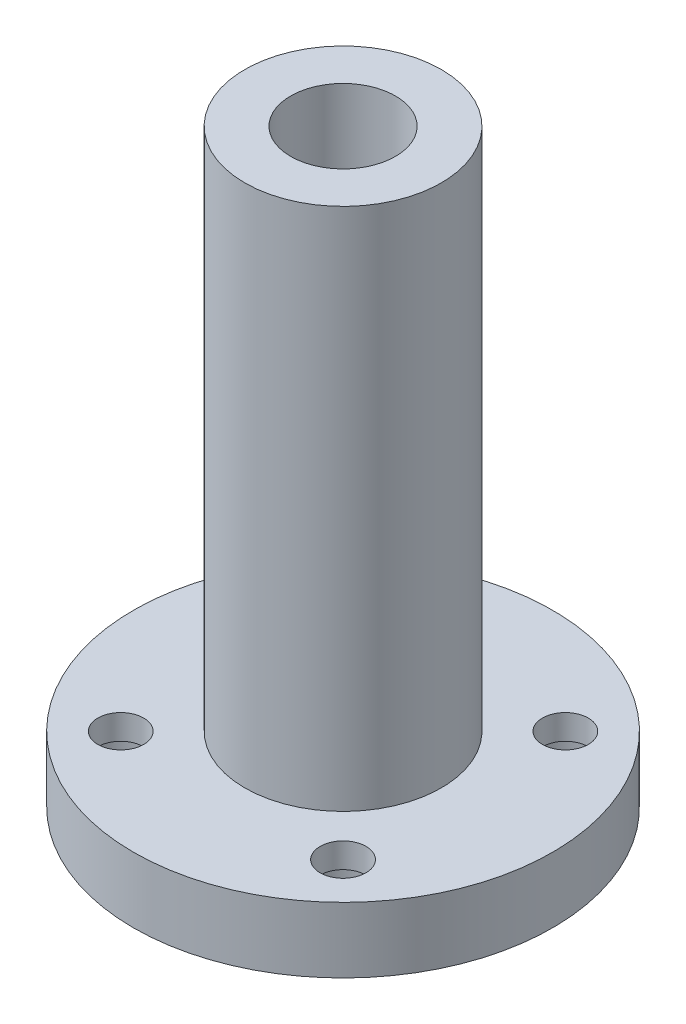
ISO-10303-21;
HEADER;
FILE_DESCRIPTION(('STEP AP214'),'2;1');
FILE_NAME('part.step','',(''),(''),'','','');
FILE_SCHEMA(('AUTOMOTIVE_DESIGN { 1 0 10303 214 1 1 1 1 }'));
ENDSEC;
DATA;
#1=APPLICATION_CONTEXT('core data for automotive mechanical design processes');
#2=APPLICATION_PROTOCOL_DEFINITION('international standard','automotive_design',2000,#1);
#3=PRODUCT_CONTEXT('',#1,'mechanical');
#4=PRODUCT('Part','Part','',(#3));
#5=PRODUCT_RELATED_PRODUCT_CATEGORY('part','',(#4));
#6=PRODUCT_DEFINITION_FORMATION('','',#4);
#7=PRODUCT_DEFINITION_CONTEXT('part definition',#1,'design');
#8=PRODUCT_DEFINITION('design','',#6,#7);
#9=PRODUCT_DEFINITION_SHAPE('','',#8);
#10=(LENGTH_UNIT() NAMED_UNIT(*) SI_UNIT(.MILLI.,.METRE.));
#11=(NAMED_UNIT(*) PLANE_ANGLE_UNIT() SI_UNIT($,.RADIAN.));
#12=(NAMED_UNIT(*) SI_UNIT($,.STERADIAN.) SOLID_ANGLE_UNIT());
#13=UNCERTAINTY_MEASURE_WITH_UNIT(LENGTH_MEASURE(1.E-05),#10,'distance_accuracy_value','');
#14=(GEOMETRIC_REPRESENTATION_CONTEXT(3) GLOBAL_UNCERTAINTY_ASSIGNED_CONTEXT((#13)) GLOBAL_UNIT_ASSIGNED_CONTEXT((#10,
#11,#12)) REPRESENTATION_CONTEXT('',''));
#15=CARTESIAN_POINT('',(0.,0.,0.));
#16=DIRECTION('',(0.,0.,1.));
#17=DIRECTION('',(1.,0.,0.));
#18=AXIS2_PLACEMENT_3D('',#15,#16,#17);
#19=CARTESIAN_POINT('',(0.,0.,0.));
#20=DIRECTION('',(0.,1.,0.));
#21=DIRECTION('',(0.,0.,1.));
#22=AXIS2_PLACEMENT_3D('',#19,#20,#21);
#23=PLANE('',#22);
#24=CARTESIAN_POINT('',(8.48528137423855,0.,8.48528137423859));
#25=DIRECTION('',(0.,-1.,0.));
#26=DIRECTION('',(0.,0.,-1.));
#27=AXIS2_PLACEMENT_3D('',#24,#25,#26);
#28=CIRCLE('',#27,3.);
#29=CARTESIAN_POINT('',(8.48528137423855,0.,5.48528137423859));
#30=VERTEX_POINT('',#29);
#31=EDGE_CURVE('E60',#30,#30,#28,.T.);
#32=ORIENTED_EDGE('',*,*,#31,.F.);
#33=EDGE_LOOP('',(#32));
#34=FACE_BOUND('',#33,.T.);
#35=CARTESIAN_POINT('',(8.48528137423862,0.,-8.48528137423853));
#36=DIRECTION('',(0.,-1.,0.));
#37=DIRECTION('',(0.,0.,-1.));
#38=AXIS2_PLACEMENT_3D('',#35,#36,#37);
#39=CIRCLE('',#38,3.);
#40=CARTESIAN_POINT('',(8.48528137423862,0.,-11.4852813742385));
#41=VERTEX_POINT('',#40);
#42=EDGE_CURVE('E47',#41,#41,#39,.T.);
#43=ORIENTED_EDGE('',*,*,#42,.F.);
#44=EDGE_LOOP('',(#43));
#45=FACE_BOUND('',#44,.T.);
#46=CARTESIAN_POINT('',(-8.48528137423855,0.,-8.48528137423859));
#47=DIRECTION('',(0.,-1.,0.));
#48=DIRECTION('',(0.,0.,-1.));
#49=AXIS2_PLACEMENT_3D('',#46,#47,#48);
#50=CIRCLE('',#49,3.);
#51=CARTESIAN_POINT('',(-8.48528137423855,0.,-11.4852813742386));
#52=VERTEX_POINT('',#51);
#53=EDGE_CURVE('E43',#52,#52,#50,.T.);
#54=ORIENTED_EDGE('',*,*,#53,.F.);
#55=EDGE_LOOP('',(#54));
#56=FACE_BOUND('',#55,.T.);
#57=CARTESIAN_POINT('',(0.,0.,0.));
#58=DIRECTION('',(0.,1.,0.));
#59=DIRECTION('',(0.,0.,1.));
#60=AXIS2_PLACEMENT_3D('',#57,#58,#59);
#61=CIRCLE('',#60,16.);
#62=CARTESIAN_POINT('',(0.,0.,16.));
#63=VERTEX_POINT('',#62);
#64=EDGE_CURVE('E10',#63,#63,#61,.T.);
#65=ORIENTED_EDGE('',*,*,#64,.F.);
#66=EDGE_LOOP('',(#65));
#67=FACE_BOUND('',#66,.T.);
#68=CARTESIAN_POINT('',(0.,0.,0.));
#69=DIRECTION('',(0.,1.,0.));
#70=DIRECTION('',(0.,0.,1.));
#71=AXIS2_PLACEMENT_3D('',#68,#69,#70);
#72=CIRCLE('',#71,4.);
#73=CARTESIAN_POINT('',(0.,0.,4.));
#74=VERTEX_POINT('',#73);
#75=EDGE_CURVE('E28',#74,#74,#72,.T.);
#76=ORIENTED_EDGE('',*,*,#75,.T.);
#77=EDGE_LOOP('',(#76));
#78=FACE_BOUND('',#77,.T.);
#79=CARTESIAN_POINT('',(-8.48528137423868,0.,8.48528137423847));
#80=DIRECTION('',(0.,-1.,0.));
#81=DIRECTION('',(0.,0.,-1.));
#82=AXIS2_PLACEMENT_3D('',#79,#80,#81);
#83=CIRCLE('',#82,3.);
#84=CARTESIAN_POINT('',(-8.48528137423868,0.,5.48528137423847));
#85=VERTEX_POINT('',#84);
#86=EDGE_CURVE('E168',#85,#85,#83,.T.);
#87=ORIENTED_EDGE('',*,*,#86,.F.);
#88=EDGE_LOOP('',(#87));
#89=FACE_BOUND('',#88,.T.);
#90=ADVANCED_FACE('F15',(#34,#45,#56,#67,#78,#89),#23,.F.);
#91=CARTESIAN_POINT('',(0.,45.,0.));
#92=DIRECTION('',(0.,-1.,0.));
#93=DIRECTION('',(0.,0.,-1.));
#94=AXIS2_PLACEMENT_3D('',#91,#92,#93);
#95=CYLINDRICAL_SURFACE('',#94,16.);
#96=ORIENTED_EDGE('',*,*,#64,.T.);
#97=EDGE_LOOP('',(#96));
#98=FACE_BOUND('',#97,.T.);
#99=CARTESIAN_POINT('',(0.,5.,0.));
#100=DIRECTION('',(0.,1.,0.));
#101=DIRECTION('',(0.,0.,1.));
#102=AXIS2_PLACEMENT_3D('',#99,#100,#101);
#103=CIRCLE('',#102,16.);
#104=CARTESIAN_POINT('',(0.,5.,16.));
#105=VERTEX_POINT('',#104);
#106=EDGE_CURVE('E32',#105,#105,#103,.T.);
#107=ORIENTED_EDGE('',*,*,#106,.F.);
#108=EDGE_LOOP('',(#107));
#109=FACE_BOUND('',#108,.T.);
#110=ADVANCED_FACE('F17',(#98,#109),#95,.T.);
#111=CARTESIAN_POINT('',(0.,45.,0.));
#112=DIRECTION('',(0.,1.,0.));
#113=DIRECTION('',(0.,0.,1.));
#114=AXIS2_PLACEMENT_3D('',#111,#112,#113);
#115=PLANE('',#114);
#116=CARTESIAN_POINT('',(0.,45.,0.));
#117=DIRECTION('',(0.,1.,0.));
#118=DIRECTION('',(0.,0.,1.));
#119=AXIS2_PLACEMENT_3D('',#116,#117,#118);
#120=CIRCLE('',#119,7.5);
#121=CARTESIAN_POINT('',(0.,45.,7.5));
#122=VERTEX_POINT('',#121);
#123=EDGE_CURVE('E35',#122,#122,#120,.T.);
#124=ORIENTED_EDGE('',*,*,#123,.T.);
#125=EDGE_LOOP('',(#124));
#126=FACE_BOUND('',#125,.T.);
#127=CARTESIAN_POINT('',(0.,45.,0.));
#128=DIRECTION('',(0.,1.,0.));
#129=DIRECTION('',(0.,0.,1.));
#130=AXIS2_PLACEMENT_3D('',#127,#128,#129);
#131=CIRCLE('',#130,4.);
#132=CARTESIAN_POINT('',(0.,45.,4.));
#133=VERTEX_POINT('',#132);
#134=EDGE_CURVE('E23',#133,#133,#131,.T.);
#135=ORIENTED_EDGE('',*,*,#134,.F.);
#136=EDGE_LOOP('',(#135));
#137=FACE_BOUND('',#136,.T.);
#138=ADVANCED_FACE('F91',(#126,#137),#115,.T.);
#139=CARTESIAN_POINT('',(0.,45.,0.));
#140=DIRECTION('',(0.,-1.,0.));
#141=DIRECTION('',(0.,0.,-1.));
#142=AXIS2_PLACEMENT_3D('',#139,#140,#141);
#143=CYLINDRICAL_SURFACE('',#142,4.);
#144=ORIENTED_EDGE('',*,*,#134,.T.);
#145=EDGE_LOOP('',(#144));
#146=FACE_BOUND('',#145,.T.);
#147=ORIENTED_EDGE('',*,*,#75,.F.);
#148=EDGE_LOOP('',(#147));
#149=FACE_BOUND('',#148,.T.);
#150=ADVANCED_FACE('F85',(#146,#149),#143,.F.);
#151=CARTESIAN_POINT('',(0.,5.,0.));
#152=DIRECTION('',(0.,1.,0.));
#153=DIRECTION('',(0.,0.,1.));
#154=AXIS2_PLACEMENT_3D('',#151,#152,#153);
#155=PLANE('',#154);
#156=CARTESIAN_POINT('',(-8.48528137423868,5.,8.48528137423847));
#157=DIRECTION('',(0.,1.,0.));
#158=DIRECTION('',(0.,0.,1.));
#159=AXIS2_PLACEMENT_3D('',#156,#157,#158);
#160=CIRCLE('',#159,1.75);
#161=CARTESIAN_POINT('',(-8.48528137423868,5.,10.2352813742385));
#162=VERTEX_POINT('',#161);
#163=EDGE_CURVE('E19',#162,#162,#160,.T.);
#164=ORIENTED_EDGE('',*,*,#163,.F.);
#165=EDGE_LOOP('',(#164));
#166=FACE_BOUND('',#165,.T.);
#167=CARTESIAN_POINT('',(8.48528137423855,5.,8.48528137423859));
#168=DIRECTION('',(0.,1.,0.));
#169=DIRECTION('',(0.,0.,1.));
#170=AXIS2_PLACEMENT_3D('',#167,#168,#169);
#171=CIRCLE('',#170,1.75);
#172=CARTESIAN_POINT('',(8.48528137423855,5.,10.2352813742386));
#173=VERTEX_POINT('',#172);
#174=EDGE_CURVE('E45',#173,#173,#171,.T.);
#175=ORIENTED_EDGE('',*,*,#174,.F.);
#176=EDGE_LOOP('',(#175));
#177=FACE_BOUND('',#176,.T.);
#178=CARTESIAN_POINT('',(8.48528137423862,5.,-8.48528137423853));
#179=DIRECTION('',(0.,1.,0.));
#180=DIRECTION('',(0.,0.,1.));
#181=AXIS2_PLACEMENT_3D('',#178,#179,#180);
#182=CIRCLE('',#181,1.75);
#183=CARTESIAN_POINT('',(8.48528137423862,5.,-6.73528137423853));
#184=VERTEX_POINT('',#183);
#185=EDGE_CURVE('E41',#184,#184,#182,.T.);
#186=ORIENTED_EDGE('',*,*,#185,.F.);
#187=EDGE_LOOP('',(#186));
#188=FACE_BOUND('',#187,.T.);
#189=CARTESIAN_POINT('',(-8.48528137423855,5.,-8.48528137423859));
#190=DIRECTION('',(0.,1.,0.));
#191=DIRECTION('',(0.,0.,1.));
#192=AXIS2_PLACEMENT_3D('',#189,#190,#191);
#193=CIRCLE('',#192,1.75);
#194=CARTESIAN_POINT('',(-8.48528137423855,5.,-6.73528137423859));
#195=VERTEX_POINT('',#194);
#196=EDGE_CURVE('E36',#195,#195,#193,.T.);
#197=ORIENTED_EDGE('',*,*,#196,.F.);
#198=EDGE_LOOP('',(#197));
#199=FACE_BOUND('',#198,.T.);
#200=CARTESIAN_POINT('',(0.,5.,0.));
#201=DIRECTION('',(0.,1.,0.));
#202=DIRECTION('',(0.,0.,1.));
#203=AXIS2_PLACEMENT_3D('',#200,#201,#202);
#204=CIRCLE('',#203,7.5);
#205=CARTESIAN_POINT('',(0.,5.,7.5));
#206=VERTEX_POINT('',#205);
#207=EDGE_CURVE('E39',#206,#206,#204,.T.);
#208=ORIENTED_EDGE('',*,*,#207,.F.);
#209=EDGE_LOOP('',(#208));
#210=FACE_BOUND('',#209,.T.);
#211=ORIENTED_EDGE('',*,*,#106,.T.);
#212=EDGE_LOOP('',(#211));
#213=FACE_BOUND('',#212,.T.);
#214=ADVANCED_FACE('F82',(#166,#177,#188,#199,#210,#213),#155,.T.);
#215=CARTESIAN_POINT('',(0.,45.,0.));
#216=DIRECTION('',(0.,-1.,0.));
#217=DIRECTION('',(0.,0.,-1.));
#218=AXIS2_PLACEMENT_3D('',#215,#216,#217);
#219=CYLINDRICAL_SURFACE('',#218,7.5);
#220=ORIENTED_EDGE('',*,*,#123,.F.);
#221=EDGE_LOOP('',(#220));
#222=FACE_BOUND('',#221,.T.);
#223=ORIENTED_EDGE('',*,*,#207,.T.);
#224=EDGE_LOOP('',(#223));
#225=FACE_BOUND('',#224,.T.);
#226=ADVANCED_FACE('F80',(#222,#225),#219,.T.);
#227=CARTESIAN_POINT('',(-8.48528137423855,0.,-8.48528137423859));
#228=DIRECTION('',(0.,-1.,0.));
#229=DIRECTION('',(0.,0.,-1.));
#230=AXIS2_PLACEMENT_3D('',#227,#228,#229);
#231=CYLINDRICAL_SURFACE('',#230,1.75);
#232=ORIENTED_EDGE('',*,*,#196,.T.);
#233=EDGE_LOOP('',(#232));
#234=FACE_BOUND('',#233,.T.);
#235=CARTESIAN_POINT('',(-8.48528137423855,3.1,-8.48528137423859));
#236=DIRECTION('',(0.,-1.,0.));
#237=DIRECTION('',(0.,0.,-1.));
#238=AXIS2_PLACEMENT_3D('',#235,#236,#237);
#239=CIRCLE('',#238,1.75);
#240=CARTESIAN_POINT('',(-8.48528137423855,3.1,-10.2352813742386));
#241=VERTEX_POINT('',#240);
#242=EDGE_CURVE('E40',#241,#241,#239,.T.);
#243=ORIENTED_EDGE('',*,*,#242,.T.);
#244=EDGE_LOOP('',(#243));
#245=FACE_BOUND('',#244,.T.);
#246=ADVANCED_FACE('F112',(#234,#245),#231,.F.);
#247=CARTESIAN_POINT('',(-6.73528137423855,3.1,-8.48528137423859));
#248=DIRECTION('',(0.,1.,0.));
#249=DIRECTION('',(0.,0.,1.));
#250=AXIS2_PLACEMENT_3D('',#247,#248,#249);
#251=PLANE('',#250);
#252=ORIENTED_EDGE('',*,*,#242,.F.);
#253=EDGE_LOOP('',(#252));
#254=FACE_BOUND('',#253,.T.);
#255=CARTESIAN_POINT('',(-8.48528137423855,3.1,-8.48528137423859));
#256=DIRECTION('',(0.,-1.,0.));
#257=DIRECTION('',(0.,0.,-1.));
#258=AXIS2_PLACEMENT_3D('',#255,#256,#257);
#259=CIRCLE('',#258,3.);
#260=CARTESIAN_POINT('',(-8.48528137423855,3.1,-11.4852813742386));
#261=VERTEX_POINT('',#260);
#262=EDGE_CURVE('E70',#261,#261,#259,.T.);
#263=ORIENTED_EDGE('',*,*,#262,.T.);
#264=EDGE_LOOP('',(#263));
#265=FACE_BOUND('',#264,.T.);
#266=ADVANCED_FACE('F116',(#254,#265),#251,.F.);
#267=CARTESIAN_POINT('',(-8.48528137423855,0.,-8.48528137423859));
#268=DIRECTION('',(0.,-1.,0.));
#269=DIRECTION('',(0.,0.,-1.));
#270=AXIS2_PLACEMENT_3D('',#267,#268,#269);
#271=CYLINDRICAL_SURFACE('',#270,3.);
#272=ORIENTED_EDGE('',*,*,#262,.F.);
#273=EDGE_LOOP('',(#272));
#274=FACE_BOUND('',#273,.T.);
#275=ORIENTED_EDGE('',*,*,#53,.T.);
#276=EDGE_LOOP('',(#275));
#277=FACE_BOUND('',#276,.T.);
#278=ADVANCED_FACE('F120',(#274,#277),#271,.F.);
#279=CARTESIAN_POINT('',(8.48528137423862,0.,-8.48528137423853));
#280=DIRECTION('',(0.,-1.,0.));
#281=DIRECTION('',(0.,0.,-1.));
#282=AXIS2_PLACEMENT_3D('',#279,#280,#281);
#283=CYLINDRICAL_SURFACE('',#282,1.75);
#284=ORIENTED_EDGE('',*,*,#185,.T.);
#285=EDGE_LOOP('',(#284));
#286=FACE_BOUND('',#285,.T.);
#287=CARTESIAN_POINT('',(8.48528137423862,3.1,-8.48528137423853));
#288=DIRECTION('',(0.,-1.,0.));
#289=DIRECTION('',(0.,0.,-1.));
#290=AXIS2_PLACEMENT_3D('',#287,#288,#289);
#291=CIRCLE('',#290,1.75);
#292=CARTESIAN_POINT('',(8.48528137423862,3.1,-10.2352813742385));
#293=VERTEX_POINT('',#292);
#294=EDGE_CURVE('E44',#293,#293,#291,.T.);
#295=ORIENTED_EDGE('',*,*,#294,.T.);
#296=EDGE_LOOP('',(#295));
#297=FACE_BOUND('',#296,.T.);
#298=ADVANCED_FACE('F124',(#286,#297),#283,.F.);
#299=CARTESIAN_POINT('',(10.2352813742386,3.1,-8.48528137423853));
#300=DIRECTION('',(0.,1.,0.));
#301=DIRECTION('',(0.,0.,1.));
#302=AXIS2_PLACEMENT_3D('',#299,#300,#301);
#303=PLANE('',#302);
#304=ORIENTED_EDGE('',*,*,#294,.F.);
#305=EDGE_LOOP('',(#304));
#306=FACE_BOUND('',#305,.T.);
#307=CARTESIAN_POINT('',(8.48528137423862,3.1,-8.48528137423853));
#308=DIRECTION('',(0.,-1.,0.));
#309=DIRECTION('',(0.,0.,-1.));
#310=AXIS2_PLACEMENT_3D('',#307,#308,#309);
#311=CIRCLE('',#310,3.);
#312=CARTESIAN_POINT('',(8.48528137423862,3.1,-11.4852813742385));
#313=VERTEX_POINT('',#312);
#314=EDGE_CURVE('E52',#313,#313,#311,.T.);
#315=ORIENTED_EDGE('',*,*,#314,.T.);
#316=EDGE_LOOP('',(#315));
#317=FACE_BOUND('',#316,.T.);
#318=ADVANCED_FACE('F128',(#306,#317),#303,.F.);
#319=CARTESIAN_POINT('',(8.48528137423862,0.,-8.48528137423853));
#320=DIRECTION('',(0.,-1.,0.));
#321=DIRECTION('',(0.,0.,-1.));
#322=AXIS2_PLACEMENT_3D('',#319,#320,#321);
#323=CYLINDRICAL_SURFACE('',#322,3.);
#324=ORIENTED_EDGE('',*,*,#314,.F.);
#325=EDGE_LOOP('',(#324));
#326=FACE_BOUND('',#325,.T.);
#327=ORIENTED_EDGE('',*,*,#42,.T.);
#328=EDGE_LOOP('',(#327));
#329=FACE_BOUND('',#328,.T.);
#330=ADVANCED_FACE('F132',(#326,#329),#323,.F.);
#331=CARTESIAN_POINT('',(8.48528137423855,0.,8.48528137423859));
#332=DIRECTION('',(0.,-1.,0.));
#333=DIRECTION('',(0.,0.,-1.));
#334=AXIS2_PLACEMENT_3D('',#331,#332,#333);
#335=CYLINDRICAL_SURFACE('',#334,1.75);
#336=ORIENTED_EDGE('',*,*,#174,.T.);
#337=EDGE_LOOP('',(#336));
#338=FACE_BOUND('',#337,.T.);
#339=CARTESIAN_POINT('',(8.48528137423855,3.1,8.48528137423859));
#340=DIRECTION('',(0.,-1.,0.));
#341=DIRECTION('',(0.,0.,-1.));
#342=AXIS2_PLACEMENT_3D('',#339,#340,#341);
#343=CIRCLE('',#342,1.75);
#344=CARTESIAN_POINT('',(8.48528137423855,3.1,6.73528137423859));
#345=VERTEX_POINT('',#344);
#346=EDGE_CURVE('E48',#345,#345,#343,.T.);
#347=ORIENTED_EDGE('',*,*,#346,.T.);
#348=EDGE_LOOP('',(#347));
#349=FACE_BOUND('',#348,.T.);
#350=ADVANCED_FACE('F136',(#338,#349),#335,.F.);
#351=CARTESIAN_POINT('',(10.2352813742386,3.1,8.48528137423859));
#352=DIRECTION('',(0.,1.,0.));
#353=DIRECTION('',(0.,0.,1.));
#354=AXIS2_PLACEMENT_3D('',#351,#352,#353);
#355=PLANE('',#354);
#356=ORIENTED_EDGE('',*,*,#346,.F.);
#357=EDGE_LOOP('',(#356));
#358=FACE_BOUND('',#357,.T.);
#359=CARTESIAN_POINT('',(8.48528137423855,3.1,8.48528137423859));
#360=DIRECTION('',(0.,-1.,0.));
#361=DIRECTION('',(0.,0.,-1.));
#362=AXIS2_PLACEMENT_3D('',#359,#360,#361);
#363=CIRCLE('',#362,3.);
#364=CARTESIAN_POINT('',(8.48528137423855,3.1,5.48528137423859));
#365=VERTEX_POINT('',#364);
#366=EDGE_CURVE('E55',#365,#365,#363,.T.);
#367=ORIENTED_EDGE('',*,*,#366,.T.);
#368=EDGE_LOOP('',(#367));
#369=FACE_BOUND('',#368,.T.);
#370=ADVANCED_FACE('F140',(#358,#369),#355,.F.);
#371=CARTESIAN_POINT('',(8.48528137423855,0.,8.48528137423859));
#372=DIRECTION('',(0.,-1.,0.));
#373=DIRECTION('',(0.,0.,-1.));
#374=AXIS2_PLACEMENT_3D('',#371,#372,#373);
#375=CYLINDRICAL_SURFACE('',#374,3.);
#376=ORIENTED_EDGE('',*,*,#366,.F.);
#377=EDGE_LOOP('',(#376));
#378=FACE_BOUND('',#377,.T.);
#379=ORIENTED_EDGE('',*,*,#31,.T.);
#380=EDGE_LOOP('',(#379));
#381=FACE_BOUND('',#380,.T.);
#382=ADVANCED_FACE('F143',(#378,#381),#375,.F.);
#383=CARTESIAN_POINT('',(-8.48528137423868,0.,8.48528137423847));
#384=DIRECTION('',(0.,-1.,0.));
#385=DIRECTION('',(0.,0.,-1.));
#386=AXIS2_PLACEMENT_3D('',#383,#384,#385);
#387=CYLINDRICAL_SURFACE('',#386,1.75);
#388=ORIENTED_EDGE('',*,*,#163,.T.);
#389=EDGE_LOOP('',(#388));
#390=FACE_BOUND('',#389,.T.);
#391=CARTESIAN_POINT('',(-8.48528137423868,3.1,8.48528137423847));
#392=DIRECTION('',(0.,-1.,0.));
#393=DIRECTION('',(0.,0.,-1.));
#394=AXIS2_PLACEMENT_3D('',#391,#392,#393);
#395=CIRCLE('',#394,1.75);
#396=CARTESIAN_POINT('',(-8.48528137423868,3.1,6.73528137423847));
#397=VERTEX_POINT('',#396);
#398=EDGE_CURVE('E171',#397,#397,#395,.T.);
#399=ORIENTED_EDGE('',*,*,#398,.T.);
#400=EDGE_LOOP('',(#399));
#401=FACE_BOUND('',#400,.T.);
#402=ADVANCED_FACE('F147',(#390,#401),#387,.F.);
#403=CARTESIAN_POINT('',(-6.73528137423867,3.1,8.48528137423847));
#404=DIRECTION('',(0.,1.,0.));
#405=DIRECTION('',(0.,0.,1.));
#406=AXIS2_PLACEMENT_3D('',#403,#404,#405);
#407=PLANE('',#406);
#408=ORIENTED_EDGE('',*,*,#398,.F.);
#409=EDGE_LOOP('',(#408));
#410=FACE_BOUND('',#409,.T.);
#411=CARTESIAN_POINT('',(-8.48528137423868,3.1,8.48528137423847));
#412=DIRECTION('',(0.,-1.,0.));
#413=DIRECTION('',(0.,0.,-1.));
#414=AXIS2_PLACEMENT_3D('',#411,#412,#413);
#415=CIRCLE('',#414,3.);
#416=CARTESIAN_POINT('',(-8.48528137423868,3.1,5.48528137423847));
#417=VERTEX_POINT('',#416);
#418=EDGE_CURVE('E165',#417,#417,#415,.T.);
#419=ORIENTED_EDGE('',*,*,#418,.T.);
#420=EDGE_LOOP('',(#419));
#421=FACE_BOUND('',#420,.T.);
#422=ADVANCED_FACE('F151',(#410,#421),#407,.F.);
#423=CARTESIAN_POINT('',(-8.48528137423868,0.,8.48528137423847));
#424=DIRECTION('',(0.,-1.,0.));
#425=DIRECTION('',(0.,0.,-1.));
#426=AXIS2_PLACEMENT_3D('',#423,#424,#425);
#427=CYLINDRICAL_SURFACE('',#426,3.);
#428=ORIENTED_EDGE('',*,*,#418,.F.);
#429=EDGE_LOOP('',(#428));
#430=FACE_BOUND('',#429,.T.);
#431=ORIENTED_EDGE('',*,*,#86,.T.);
#432=EDGE_LOOP('',(#431));
#433=FACE_BOUND('',#432,.T.);
#434=ADVANCED_FACE('F155',(#430,#433),#427,.F.);
#435=CLOSED_SHELL('',(#90,#110,#138,#150,#214,#226,#246,#266,#278,#298,#318,#330,#350,#370,#382,
#402,#422,#434));
#436=MANIFOLD_SOLID_BREP('B1',#435);
#437=ADVANCED_BREP_SHAPE_REPRESENTATION('',(#18,#436),#14);
#438=SHAPE_DEFINITION_REPRESENTATION(#9,#437);
ENDSEC;
END-ISO-10303-21;
